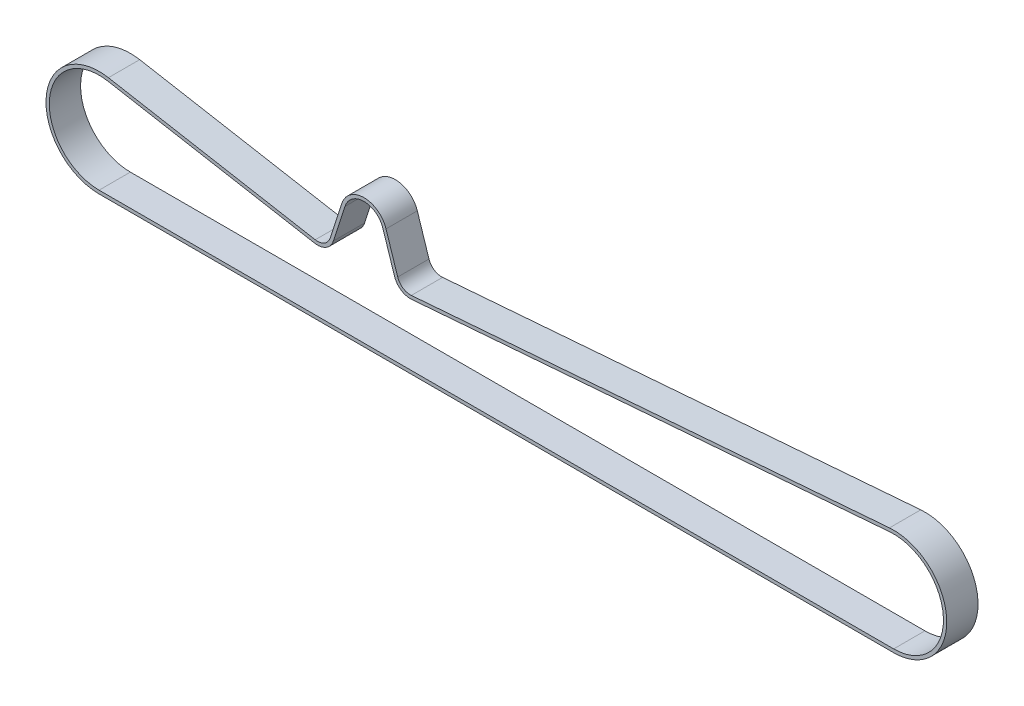
ISO-10303-21;
HEADER;
FILE_DESCRIPTION(('STEP AP214'),'2;1');
FILE_NAME('part.step','',(''),(''),'','','');
FILE_SCHEMA(('AUTOMOTIVE_DESIGN { 1 0 10303 214 1 1 1 1 }'));
ENDSEC;
DATA;
#1=APPLICATION_CONTEXT('core data for automotive mechanical design processes');
#2=APPLICATION_PROTOCOL_DEFINITION('international standard','automotive_design',2000,#1);
#3=PRODUCT_CONTEXT('',#1,'mechanical');
#4=PRODUCT('Part','Part','',(#3));
#5=PRODUCT_RELATED_PRODUCT_CATEGORY('part','',(#4));
#6=PRODUCT_DEFINITION_FORMATION('','',#4);
#7=PRODUCT_DEFINITION_CONTEXT('part definition',#1,'design');
#8=PRODUCT_DEFINITION('design','',#6,#7);
#9=PRODUCT_DEFINITION_SHAPE('','',#8);
#10=(LENGTH_UNIT() NAMED_UNIT(*) SI_UNIT(.MILLI.,.METRE.));
#11=(NAMED_UNIT(*) PLANE_ANGLE_UNIT() SI_UNIT($,.RADIAN.));
#12=(NAMED_UNIT(*) SI_UNIT($,.STERADIAN.) SOLID_ANGLE_UNIT());
#13=UNCERTAINTY_MEASURE_WITH_UNIT(LENGTH_MEASURE(1.E-05),#10,'distance_accuracy_value','');
#14=(GEOMETRIC_REPRESENTATION_CONTEXT(3) GLOBAL_UNCERTAINTY_ASSIGNED_CONTEXT((#13)) GLOBAL_UNIT_ASSIGNED_CONTEXT((#10,
#11,#12)) REPRESENTATION_CONTEXT('',''));
#15=CARTESIAN_POINT('',(0.,0.,0.));
#16=DIRECTION('',(0.,0.,1.));
#17=DIRECTION('',(1.,0.,0.));
#18=AXIS2_PLACEMENT_3D('',#15,#16,#17);
#19=CARTESIAN_POINT('',(104.775,13.6073270649897,7.5));
#20=DIRECTION('',(0.,0.,1.));
#21=DIRECTION('',(1.,0.,0.));
#22=AXIS2_PLACEMENT_3D('',#19,#20,#21);
#23=PLANE('',#22);
#24=CARTESIAN_POINT('',(104.775,13.6073270649897,7.5));
#25=DIRECTION('',(0.,0.,-1.));
#26=DIRECTION('',(1.,0.,0.));
#27=AXIS2_PLACEMENT_3D('',#24,#25,#26);
#28=CIRCLE('',#27,6.35);
#29=CARTESIAN_POINT('',(110.813645019597,11.6433346191558,7.5));
#30=VERTEX_POINT('',#29);
#31=CARTESIAN_POINT('',(103.658753775867,7.35620761587434,7.5));
#32=VERTEX_POINT('',#31);
#33=EDGE_CURVE('E294',#30,#32,#28,.T.);
#34=ORIENTED_EDGE('',*,*,#33,.T.);
#35=DIRECTION('',(-0.984428259703203,0.17578680695013,0.));
#36=VECTOR('',#35,1.);
#37=CARTESIAN_POINT('',(103.658753775867,7.35620761587434,7.5));
#38=LINE('',#37,#36);
#39=CARTESIAN_POINT('',(4.47614735877465,25.0669889909525,7.5));
#40=VERTEX_POINT('',#39);
#41=EDGE_CURVE('E297',#32,#40,#38,.T.);
#42=ORIENTED_EDGE('',*,*,#41,.T.);
#43=CARTESIAN_POINT('',(0.,0.,7.5));
#44=DIRECTION('',(0.,0.,1.));
#45=DIRECTION('',(1.,0.,0.));
#46=AXIS2_PLACEMENT_3D('',#43,#44,#45);
#47=CIRCLE('',#46,25.4635);
#48=CARTESIAN_POINT('',(0.,-25.4635,7.5));
#49=VERTEX_POINT('',#48);
#50=EDGE_CURVE('E301',#40,#49,#47,.T.);
#51=ORIENTED_EDGE('',*,*,#50,.T.);
#52=DIRECTION('',(1.,0.,0.));
#53=VECTOR('',#52,1.);
#54=CARTESIAN_POINT('',(0.,-25.4635,7.5));
#55=LINE('',#54,#53);
#56=CARTESIAN_POINT('',(381.,-25.4635,7.5));
#57=VERTEX_POINT('',#56);
#58=EDGE_CURVE('E304',#49,#57,#55,.T.);
#59=ORIENTED_EDGE('',*,*,#58,.T.);
#60=CARTESIAN_POINT('',(381.,0.,7.5));
#61=DIRECTION('',(0.,0.,1.));
#62=DIRECTION('',(-1.,0.,0.));
#63=AXIS2_PLACEMENT_3D('',#60,#61,#62);
#64=CIRCLE('',#63,25.4635);
#65=CARTESIAN_POINT('',(378.995174246493,25.3844540210751,7.5));
#66=VERTEX_POINT('',#65);
#67=EDGE_CURVE('E306',#57,#66,#64,.T.);
#68=ORIENTED_EDGE('',*,*,#67,.T.);
#69=DIRECTION('',(-0.996895714299884,-0.0787333144896342,0.));
#70=VECTOR('',#69,1.);
#71=CARTESIAN_POINT('',(378.995174246493,25.3844540210751,7.5));
#72=LINE('',#71,#70);
#73=CARTESIAN_POINT('',(149.724956547009,7.27703927918541,7.5));
#74=VERTEX_POINT('',#73);
#75=EDGE_CURVE('E308',#66,#74,#72,.T.);
#76=ORIENTED_EDGE('',*,*,#75,.T.);
#77=CARTESIAN_POINT('',(149.225,13.6073270649897,7.5));
#78=DIRECTION('',(0.,0.,-1.));
#79=DIRECTION('',(1.,0.,0.));
#80=AXIS2_PLACEMENT_3D('',#77,#78,#79);
#81=CIRCLE('',#80,6.35);
#82=CARTESIAN_POINT('',(143.186354980403,11.6433346191558,7.5));
#83=VERTEX_POINT('',#82);
#84=EDGE_CURVE('E311',#74,#83,#81,.T.);
#85=ORIENTED_EDGE('',*,*,#84,.T.);
#86=DIRECTION('',(-0.309290148950221,0.950967719621623,0.));
#87=VECTOR('',#86,1.);
#88=CARTESIAN_POINT('',(143.186354980403,11.6433346191558,7.5));
#89=LINE('',#88,#87);
#90=CARTESIAN_POINT('',(137.591783364374,28.8448427499927,7.5));
#91=VERTEX_POINT('',#90);
#92=EDGE_CURVE('E313',#83,#91,#89,.T.);
#93=ORIENTED_EDGE('',*,*,#92,.T.);
#94=CARTESIAN_POINT('',(127.,25.4,7.5));
#95=DIRECTION('',(0.,0.,1.));
#96=DIRECTION('',(-1.,0.,0.));
#97=AXIS2_PLACEMENT_3D('',#94,#95,#96);
#98=CIRCLE('',#97,11.1379);
#99=CARTESIAN_POINT('',(116.408216635626,28.8448427499927,7.5));
#100=VERTEX_POINT('',#99);
#101=EDGE_CURVE('E316',#91,#100,#98,.T.);
#102=ORIENTED_EDGE('',*,*,#101,.T.);
#103=DIRECTION('',(-0.309290148950219,-0.950967719621624,0.));
#104=VECTOR('',#103,1.);
#105=CARTESIAN_POINT('',(116.408216635626,28.8448427499927,7.5));
#106=LINE('',#105,#104);
#107=EDGE_CURVE('E319',#100,#30,#106,.T.);
#108=ORIENTED_EDGE('',*,*,#107,.T.);
#109=EDGE_LOOP('',(#34,#42,#51,#59,#68,#76,#85,#93,#102,#108));
#110=FACE_BOUND('',#109,.T.);
#111=DIRECTION('',(1.,0.,0.));
#112=VECTOR('',#111,1.);
#113=CARTESIAN_POINT('',(0.,-23.876,7.5));
#114=LINE('',#113,#112);
#115=CARTESIAN_POINT('',(0.,-23.876,7.5));
#116=VERTEX_POINT('',#115);
#117=CARTESIAN_POINT('',(381.,-23.876,7.5));
#118=VERTEX_POINT('',#117);
#119=EDGE_CURVE('E203',#116,#118,#114,.T.);
#120=ORIENTED_EDGE('',*,*,#119,.F.);
#121=CARTESIAN_POINT('',(0.,0.,7.5));
#122=DIRECTION('',(0.,0.,1.));
#123=DIRECTION('',(1.,0.,0.));
#124=AXIS2_PLACEMENT_3D('',#121,#122,#123);
#125=CIRCLE('',#124,23.876);
#126=CARTESIAN_POINT('',(4.19708580274131,23.5042091286737,7.5));
#127=VERTEX_POINT('',#126);
#128=EDGE_CURVE('E195',#127,#116,#125,.T.);
#129=ORIENTED_EDGE('',*,*,#128,.F.);
#130=DIRECTION('',(-0.984428259703203,0.17578680695013,0.));
#131=VECTOR('',#130,1.);
#132=CARTESIAN_POINT('',(103.379692219833,5.7934277535955,7.5));
#133=LINE('',#132,#131);
#134=CARTESIAN_POINT('',(103.379692219833,5.7934277535955,7.5));
#135=VERTEX_POINT('',#134);
#136=EDGE_CURVE('E239',#135,#127,#133,.T.);
#137=ORIENTED_EDGE('',*,*,#136,.F.);
#138=CARTESIAN_POINT('',(104.775,13.6073270649897,7.5));
#139=DIRECTION('',(0.,0.,-1.));
#140=DIRECTION('',(1.,0.,0.));
#141=AXIS2_PLACEMENT_3D('',#138,#139,#140);
#142=CIRCLE('',#141,7.9375);
#143=CARTESIAN_POINT('',(112.323306274497,11.1523365076973,7.5));
#144=VERTEX_POINT('',#143);
#145=EDGE_CURVE('E237',#144,#135,#142,.T.);
#146=ORIENTED_EDGE('',*,*,#145,.F.);
#147=DIRECTION('',(-0.309290148950221,-0.950967719621623,0.));
#148=VECTOR('',#147,1.);
#149=CARTESIAN_POINT('',(117.917877890526,28.3538446385342,7.5));
#150=LINE('',#149,#148);
#151=CARTESIAN_POINT('',(117.917877890526,28.3538446385342,7.5));
#152=VERTEX_POINT('',#151);
#153=EDGE_CURVE('E235',#152,#144,#150,.T.);
#154=ORIENTED_EDGE('',*,*,#153,.F.);
#155=CARTESIAN_POINT('',(127.,25.4,7.5));
#156=DIRECTION('',(0.,0.,1.));
#157=DIRECTION('',(-1.,0.,0.));
#158=AXIS2_PLACEMENT_3D('',#155,#156,#157);
#159=CIRCLE('',#158,9.5504);
#160=CARTESIAN_POINT('',(136.082122109474,28.3538446385342,7.5));
#161=VERTEX_POINT('',#160);
#162=EDGE_CURVE('E232',#161,#152,#159,.T.);
#163=ORIENTED_EDGE('',*,*,#162,.F.);
#164=DIRECTION('',(-0.309290148950221,0.950967719621623,0.));
#165=VECTOR('',#164,1.);
#166=CARTESIAN_POINT('',(141.676693725503,11.1523365076973,7.5));
#167=LINE('',#166,#165);
#168=CARTESIAN_POINT('',(141.676693725503,11.1523365076973,7.5));
#169=VERTEX_POINT('',#168);
#170=EDGE_CURVE('E229',#169,#161,#167,.T.);
#171=ORIENTED_EDGE('',*,*,#170,.F.);
#172=CARTESIAN_POINT('',(149.225,13.6073270649897,7.5));
#173=DIRECTION('',(0.,0.,-1.));
#174=DIRECTION('',(1.,0.,0.));
#175=AXIS2_PLACEMENT_3D('',#172,#173,#174);
#176=CIRCLE('',#175,7.93749999999999);
#177=CARTESIAN_POINT('',(149.849945683761,5.69446733273435,7.5));
#178=VERTEX_POINT('',#177);
#179=EDGE_CURVE('E227',#178,#169,#176,.T.);
#180=ORIENTED_EDGE('',*,*,#179,.F.);
#181=DIRECTION('',(-0.996895714299884,-0.0787333144896342,0.));
#182=VECTOR('',#181,1.);
#183=CARTESIAN_POINT('',(379.120163383245,23.801882074624,7.5));
#184=LINE('',#183,#182);
#185=CARTESIAN_POINT('',(379.120163383245,23.801882074624,7.5));
#186=VERTEX_POINT('',#185);
#187=EDGE_CURVE('E222',#186,#178,#184,.T.);
#188=ORIENTED_EDGE('',*,*,#187,.F.);
#189=CARTESIAN_POINT('',(381.,0.,7.5));
#190=DIRECTION('',(0.,0.,1.));
#191=DIRECTION('',(-1.,0.,0.));
#192=AXIS2_PLACEMENT_3D('',#189,#190,#191);
#193=CIRCLE('',#192,23.876);
#194=EDGE_CURVE('E217',#118,#186,#193,.T.);
#195=ORIENTED_EDGE('',*,*,#194,.F.);
#196=EDGE_LOOP('',(#120,#129,#137,#146,#154,#163,#171,#180,#188,#195));
#197=FACE_BOUND('',#196,.T.);
#198=ADVANCED_FACE('F45',(#110,#197),#23,.T.);
#199=CARTESIAN_POINT('',(104.775,13.6073270649897,-7.5));
#200=DIRECTION('',(0.,0.,1.));
#201=DIRECTION('',(1.,0.,0.));
#202=AXIS2_PLACEMENT_3D('',#199,#200,#201);
#203=PLANE('',#202);
#204=CARTESIAN_POINT('',(104.775,13.6073270649897,-7.5));
#205=DIRECTION('',(0.,0.,-1.));
#206=DIRECTION('',(1.,0.,0.));
#207=AXIS2_PLACEMENT_3D('',#204,#205,#206);
#208=CIRCLE('',#207,6.35);
#209=CARTESIAN_POINT('',(110.813645019597,11.6433346191558,-7.5));
#210=VERTEX_POINT('',#209);
#211=CARTESIAN_POINT('',(103.658753775867,7.35620761587434,-7.5));
#212=VERTEX_POINT('',#211);
#213=EDGE_CURVE('E212',#210,#212,#208,.T.);
#214=ORIENTED_EDGE('',*,*,#213,.F.);
#215=DIRECTION('',(-0.309290148950219,-0.950967719621624,0.));
#216=VECTOR('',#215,1.);
#217=CARTESIAN_POINT('',(116.408216635626,28.8448427499927,-7.5));
#218=LINE('',#217,#216);
#219=CARTESIAN_POINT('',(116.408216635626,28.8448427499927,-7.5));
#220=VERTEX_POINT('',#219);
#221=EDGE_CURVE('E298',#220,#210,#218,.T.);
#222=ORIENTED_EDGE('',*,*,#221,.F.);
#223=CARTESIAN_POINT('',(127.,25.4,-7.5));
#224=DIRECTION('',(0.,0.,1.));
#225=DIRECTION('',(-1.,0.,0.));
#226=AXIS2_PLACEMENT_3D('',#223,#224,#225);
#227=CIRCLE('',#226,11.1379);
#228=CARTESIAN_POINT('',(137.591783364374,28.8448427499927,-7.5));
#229=VERTEX_POINT('',#228);
#230=EDGE_CURVE('E343',#229,#220,#227,.T.);
#231=ORIENTED_EDGE('',*,*,#230,.F.);
#232=DIRECTION('',(-0.309290148950221,0.950967719621623,0.));
#233=VECTOR('',#232,1.);
#234=CARTESIAN_POINT('',(143.186354980403,11.6433346191558,-7.5));
#235=LINE('',#234,#233);
#236=CARTESIAN_POINT('',(143.186354980403,11.6433346191558,-7.5));
#237=VERTEX_POINT('',#236);
#238=EDGE_CURVE('E341',#237,#229,#235,.T.);
#239=ORIENTED_EDGE('',*,*,#238,.F.);
#240=CARTESIAN_POINT('',(149.225,13.6073270649897,-7.5));
#241=DIRECTION('',(0.,0.,-1.));
#242=DIRECTION('',(1.,0.,0.));
#243=AXIS2_PLACEMENT_3D('',#240,#241,#242);
#244=CIRCLE('',#243,6.35);
#245=CARTESIAN_POINT('',(149.724956547009,7.27703927918541,-7.5));
#246=VERTEX_POINT('',#245);
#247=EDGE_CURVE('E338',#246,#237,#244,.T.);
#248=ORIENTED_EDGE('',*,*,#247,.F.);
#249=DIRECTION('',(-0.996895714299884,-0.0787333144896342,0.));
#250=VECTOR('',#249,1.);
#251=CARTESIAN_POINT('',(378.995174246493,25.3844540210751,-7.5));
#252=LINE('',#251,#250);
#253=CARTESIAN_POINT('',(378.995174246493,25.3844540210751,-7.5));
#254=VERTEX_POINT('',#253);
#255=EDGE_CURVE('E335',#254,#246,#252,.T.);
#256=ORIENTED_EDGE('',*,*,#255,.F.);
#257=CARTESIAN_POINT('',(381.,0.,-7.5));
#258=DIRECTION('',(0.,0.,1.));
#259=DIRECTION('',(-1.,0.,0.));
#260=AXIS2_PLACEMENT_3D('',#257,#258,#259);
#261=CIRCLE('',#260,25.4635);
#262=CARTESIAN_POINT('',(381.,-25.4635,-7.5));
#263=VERTEX_POINT('',#262);
#264=EDGE_CURVE('E333',#263,#254,#261,.T.);
#265=ORIENTED_EDGE('',*,*,#264,.F.);
#266=DIRECTION('',(1.,0.,0.));
#267=VECTOR('',#266,1.);
#268=CARTESIAN_POINT('',(0.,-25.4635,-7.5));
#269=LINE('',#268,#267);
#270=CARTESIAN_POINT('',(0.,-25.4635,-7.5));
#271=VERTEX_POINT('',#270);
#272=EDGE_CURVE('E330',#271,#263,#269,.T.);
#273=ORIENTED_EDGE('',*,*,#272,.F.);
#274=CARTESIAN_POINT('',(0.,0.,-7.5));
#275=DIRECTION('',(0.,0.,1.));
#276=DIRECTION('',(1.,0.,0.));
#277=AXIS2_PLACEMENT_3D('',#274,#275,#276);
#278=CIRCLE('',#277,25.4635);
#279=CARTESIAN_POINT('',(4.47614735877465,25.0669889909525,-7.5));
#280=VERTEX_POINT('',#279);
#281=EDGE_CURVE('E327',#280,#271,#278,.T.);
#282=ORIENTED_EDGE('',*,*,#281,.F.);
#283=DIRECTION('',(-0.984428259703203,0.17578680695013,0.));
#284=VECTOR('',#283,1.);
#285=CARTESIAN_POINT('',(103.658753775867,7.35620761587434,-7.5));
#286=LINE('',#285,#284);
#287=EDGE_CURVE('E324',#212,#280,#286,.T.);
#288=ORIENTED_EDGE('',*,*,#287,.F.);
#289=EDGE_LOOP('',(#214,#222,#231,#239,#248,#256,#265,#273,#282,#288));
#290=FACE_BOUND('',#289,.T.);
#291=CARTESIAN_POINT('',(0.,0.,-7.5));
#292=DIRECTION('',(0.,0.,1.));
#293=DIRECTION('',(1.,0.,0.));
#294=AXIS2_PLACEMENT_3D('',#291,#292,#293);
#295=CIRCLE('',#294,23.876);
#296=CARTESIAN_POINT('',(4.19708580274132,23.5042091286737,-7.5));
#297=VERTEX_POINT('',#296);
#298=CARTESIAN_POINT('',(0.,-23.876,-7.5));
#299=VERTEX_POINT('',#298);
#300=EDGE_CURVE('E68',#297,#299,#295,.T.);
#301=ORIENTED_EDGE('',*,*,#300,.T.);
#302=DIRECTION('',(1.,0.,0.));
#303=VECTOR('',#302,1.);
#304=CARTESIAN_POINT('',(0.,-23.876,-7.5));
#305=LINE('',#304,#303);
#306=CARTESIAN_POINT('',(381.,-23.876,-7.5));
#307=VERTEX_POINT('',#306);
#308=EDGE_CURVE('E210',#299,#307,#305,.T.);
#309=ORIENTED_EDGE('',*,*,#308,.T.);
#310=CARTESIAN_POINT('',(381.,0.,-7.5));
#311=DIRECTION('',(0.,0.,1.));
#312=DIRECTION('',(-1.,0.,0.));
#313=AXIS2_PLACEMENT_3D('',#310,#311,#312);
#314=CIRCLE('',#313,23.876);
#315=CARTESIAN_POINT('',(379.120163383245,23.801882074624,-7.5));
#316=VERTEX_POINT('',#315);
#317=EDGE_CURVE('E246',#307,#316,#314,.T.);
#318=ORIENTED_EDGE('',*,*,#317,.T.);
#319=DIRECTION('',(-0.996895714299884,-0.0787333144896342,0.));
#320=VECTOR('',#319,1.);
#321=CARTESIAN_POINT('',(379.120163383245,23.801882074624,-7.5));
#322=LINE('',#321,#320);
#323=CARTESIAN_POINT('',(149.849945683761,5.69446733273435,-7.5));
#324=VERTEX_POINT('',#323);
#325=EDGE_CURVE('E249',#316,#324,#322,.T.);
#326=ORIENTED_EDGE('',*,*,#325,.T.);
#327=CARTESIAN_POINT('',(149.225,13.6073270649897,-7.5));
#328=DIRECTION('',(0.,0.,-1.));
#329=DIRECTION('',(1.,0.,0.));
#330=AXIS2_PLACEMENT_3D('',#327,#328,#329);
#331=CIRCLE('',#330,7.93749999999999);
#332=CARTESIAN_POINT('',(141.676693725503,11.1523365076973,-7.5));
#333=VERTEX_POINT('',#332);
#334=EDGE_CURVE('E253',#324,#333,#331,.T.);
#335=ORIENTED_EDGE('',*,*,#334,.T.);
#336=DIRECTION('',(-0.309290148950221,0.950967719621623,0.));
#337=VECTOR('',#336,1.);
#338=CARTESIAN_POINT('',(141.676693725503,11.1523365076973,-7.5));
#339=LINE('',#338,#337);
#340=CARTESIAN_POINT('',(136.082122109474,28.3538446385342,-7.5));
#341=VERTEX_POINT('',#340);
#342=EDGE_CURVE('E257',#333,#341,#339,.T.);
#343=ORIENTED_EDGE('',*,*,#342,.T.);
#344=CARTESIAN_POINT('',(127.,25.4,-7.5));
#345=DIRECTION('',(0.,0.,1.));
#346=DIRECTION('',(-1.,0.,0.));
#347=AXIS2_PLACEMENT_3D('',#344,#345,#346);
#348=CIRCLE('',#347,9.5504);
#349=CARTESIAN_POINT('',(117.917877890526,28.3538446385342,-7.5));
#350=VERTEX_POINT('',#349);
#351=EDGE_CURVE('E261',#341,#350,#348,.T.);
#352=ORIENTED_EDGE('',*,*,#351,.T.);
#353=DIRECTION('',(-0.309290148950221,-0.950967719621623,0.));
#354=VECTOR('',#353,1.);
#355=CARTESIAN_POINT('',(117.917877890526,28.3538446385342,-7.5));
#356=LINE('',#355,#354);
#357=CARTESIAN_POINT('',(112.323306274497,11.1523365076973,-7.5));
#358=VERTEX_POINT('',#357);
#359=EDGE_CURVE('E265',#350,#358,#356,.T.);
#360=ORIENTED_EDGE('',*,*,#359,.T.);
#361=CARTESIAN_POINT('',(104.775,13.6073270649897,-7.5));
#362=DIRECTION('',(0.,0.,-1.));
#363=DIRECTION('',(1.,0.,0.));
#364=AXIS2_PLACEMENT_3D('',#361,#362,#363);
#365=CIRCLE('',#364,7.9375);
#366=CARTESIAN_POINT('',(103.379692219833,5.79342775359551,-7.5));
#367=VERTEX_POINT('',#366);
#368=EDGE_CURVE('E269',#358,#367,#365,.T.);
#369=ORIENTED_EDGE('',*,*,#368,.T.);
#370=DIRECTION('',(-0.984428259703203,0.17578680695013,0.));
#371=VECTOR('',#370,1.);
#372=CARTESIAN_POINT('',(103.379692219833,5.7934277535955,-7.5));
#373=LINE('',#372,#371);
#374=EDGE_CURVE('E204',#367,#297,#373,.T.);
#375=ORIENTED_EDGE('',*,*,#374,.T.);
#376=EDGE_LOOP('',(#301,#309,#318,#326,#335,#343,#352,#360,#369,#375));
#377=FACE_BOUND('',#376,.T.);
#378=ADVANCED_FACE('F386',(#290,#377),#203,.F.);
#379=CARTESIAN_POINT('',(104.775,13.6073270649897,7.5));
#380=DIRECTION('',(0.,0.,-1.));
#381=DIRECTION('',(-1.,0.,0.));
#382=AXIS2_PLACEMENT_3D('',#379,#380,#381);
#383=CYLINDRICAL_SURFACE('',#382,6.35);
#384=ORIENTED_EDGE('',*,*,#213,.T.);
#385=DIRECTION('',(0.,0.,-1.));
#386=VECTOR('',#385,1.);
#387=CARTESIAN_POINT('',(103.658753775867,7.35620761587434,7.5));
#388=LINE('',#387,#386);
#389=EDGE_CURVE('E11',#32,#212,#388,.T.);
#390=ORIENTED_EDGE('',*,*,#389,.F.);
#391=ORIENTED_EDGE('',*,*,#33,.F.);
#392=DIRECTION('',(0.,0.,-1.));
#393=VECTOR('',#392,1.);
#394=CARTESIAN_POINT('',(110.813645019597,11.6433346191558,7.5));
#395=LINE('',#394,#393);
#396=EDGE_CURVE('E321',#30,#210,#395,.T.);
#397=ORIENTED_EDGE('',*,*,#396,.T.);
#398=EDGE_LOOP('',(#384,#390,#391,#397));
#399=FACE_BOUND('',#398,.T.);
#400=ADVANCED_FACE('F47',(#399),#383,.F.);
#401=CARTESIAN_POINT('',(103.658753775867,7.35620761587434,7.5));
#402=DIRECTION('',(-0.17578680695013,-0.984428259703203,0.));
#403=DIRECTION('',(0.984428259703203,-0.17578680695013,0.));
#404=AXIS2_PLACEMENT_3D('',#401,#402,#403);
#405=PLANE('',#404);
#406=ORIENTED_EDGE('',*,*,#287,.T.);
#407=DIRECTION('',(0.,0.,-1.));
#408=VECTOR('',#407,1.);
#409=CARTESIAN_POINT('',(4.47614735877465,25.0669889909525,7.5));
#410=LINE('',#409,#408);
#411=EDGE_CURVE('E53',#40,#280,#410,.T.);
#412=ORIENTED_EDGE('',*,*,#411,.F.);
#413=ORIENTED_EDGE('',*,*,#41,.F.);
#414=ORIENTED_EDGE('',*,*,#389,.T.);
#415=EDGE_LOOP('',(#406,#412,#413,#414));
#416=FACE_BOUND('',#415,.T.);
#417=ADVANCED_FACE('F403',(#416),#405,.F.);
#418=CARTESIAN_POINT('',(0.,0.,7.5));
#419=DIRECTION('',(0.,0.,-1.));
#420=DIRECTION('',(-1.,0.,0.));
#421=AXIS2_PLACEMENT_3D('',#418,#419,#420);
#422=CYLINDRICAL_SURFACE('',#421,25.4635);
#423=ORIENTED_EDGE('',*,*,#281,.T.);
#424=DIRECTION('',(0.,0.,-1.));
#425=VECTOR('',#424,1.);
#426=CARTESIAN_POINT('',(0.,-25.4635,7.5));
#427=LINE('',#426,#425);
#428=EDGE_CURVE('E372',#49,#271,#427,.T.);
#429=ORIENTED_EDGE('',*,*,#428,.F.);
#430=ORIENTED_EDGE('',*,*,#50,.F.);
#431=ORIENTED_EDGE('',*,*,#411,.T.);
#432=EDGE_LOOP('',(#423,#429,#430,#431));
#433=FACE_BOUND('',#432,.T.);
#434=ADVANCED_FACE('F380',(#433),#422,.T.);
#435=CARTESIAN_POINT('',(0.,-25.4635,7.5));
#436=DIRECTION('',(0.,1.,0.));
#437=DIRECTION('',(-1.,0.,0.));
#438=AXIS2_PLACEMENT_3D('',#435,#436,#437);
#439=PLANE('',#438);
#440=ORIENTED_EDGE('',*,*,#272,.T.);
#441=DIRECTION('',(0.,0.,-1.));
#442=VECTOR('',#441,1.);
#443=CARTESIAN_POINT('',(381.,-25.4635,7.5));
#444=LINE('',#443,#442);
#445=EDGE_CURVE('E369',#57,#263,#444,.T.);
#446=ORIENTED_EDGE('',*,*,#445,.F.);
#447=ORIENTED_EDGE('',*,*,#58,.F.);
#448=ORIENTED_EDGE('',*,*,#428,.T.);
#449=EDGE_LOOP('',(#440,#446,#447,#448));
#450=FACE_BOUND('',#449,.T.);
#451=ADVANCED_FACE('F392',(#450),#439,.F.);
#452=CARTESIAN_POINT('',(381.,0.,7.5));
#453=DIRECTION('',(0.,0.,-1.));
#454=DIRECTION('',(-1.,0.,0.));
#455=AXIS2_PLACEMENT_3D('',#452,#453,#454);
#456=CYLINDRICAL_SURFACE('',#455,25.4635);
#457=ORIENTED_EDGE('',*,*,#264,.T.);
#458=DIRECTION('',(0.,0.,-1.));
#459=VECTOR('',#458,1.);
#460=CARTESIAN_POINT('',(378.995174246493,25.3844540210751,7.5));
#461=LINE('',#460,#459);
#462=EDGE_CURVE('E366',#66,#254,#461,.T.);
#463=ORIENTED_EDGE('',*,*,#462,.F.);
#464=ORIENTED_EDGE('',*,*,#67,.F.);
#465=ORIENTED_EDGE('',*,*,#445,.T.);
#466=EDGE_LOOP('',(#457,#463,#464,#465));
#467=FACE_BOUND('',#466,.T.);
#468=ADVANCED_FACE('F396',(#467),#456,.T.);
#469=CARTESIAN_POINT('',(378.995174246493,25.3844540210751,7.5));
#470=DIRECTION('',(0.0787333144896342,-0.996895714299884,0.));
#471=DIRECTION('',(0.996895714299884,0.0787333144896342,0.));
#472=AXIS2_PLACEMENT_3D('',#469,#470,#471);
#473=PLANE('',#472);
#474=ORIENTED_EDGE('',*,*,#255,.T.);
#475=DIRECTION('',(0.,0.,-1.));
#476=VECTOR('',#475,1.);
#477=CARTESIAN_POINT('',(149.724956547009,7.27703927918541,7.5));
#478=LINE('',#477,#476);
#479=EDGE_CURVE('E362',#74,#246,#478,.T.);
#480=ORIENTED_EDGE('',*,*,#479,.F.);
#481=ORIENTED_EDGE('',*,*,#75,.F.);
#482=ORIENTED_EDGE('',*,*,#462,.T.);
#483=EDGE_LOOP('',(#474,#480,#481,#482));
#484=FACE_BOUND('',#483,.T.);
#485=ADVANCED_FACE('F426',(#484),#473,.F.);
#486=CARTESIAN_POINT('',(149.225,13.6073270649897,7.5));
#487=DIRECTION('',(0.,0.,-1.));
#488=DIRECTION('',(-1.,0.,0.));
#489=AXIS2_PLACEMENT_3D('',#486,#487,#488);
#490=CYLINDRICAL_SURFACE('',#489,6.35);
#491=ORIENTED_EDGE('',*,*,#247,.T.);
#492=DIRECTION('',(0.,0.,-1.));
#493=VECTOR('',#492,1.);
#494=CARTESIAN_POINT('',(143.186354980403,11.6433346191558,7.5));
#495=LINE('',#494,#493);
#496=EDGE_CURVE('E358',#83,#237,#495,.T.);
#497=ORIENTED_EDGE('',*,*,#496,.F.);
#498=ORIENTED_EDGE('',*,*,#84,.F.);
#499=ORIENTED_EDGE('',*,*,#479,.T.);
#500=EDGE_LOOP('',(#491,#497,#498,#499));
#501=FACE_BOUND('',#500,.T.);
#502=ADVANCED_FACE('F423',(#501),#490,.F.);
#503=CARTESIAN_POINT('',(143.186354980403,11.6433346191558,7.5));
#504=DIRECTION('',(-0.950967719621623,-0.309290148950221,0.));
#505=DIRECTION('',(0.309290148950221,-0.950967719621623,0.));
#506=AXIS2_PLACEMENT_3D('',#503,#504,#505);
#507=PLANE('',#506);
#508=ORIENTED_EDGE('',*,*,#238,.T.);
#509=DIRECTION('',(0.,0.,-1.));
#510=VECTOR('',#509,1.);
#511=CARTESIAN_POINT('',(137.591783364374,28.8448427499927,7.5));
#512=LINE('',#511,#510);
#513=EDGE_CURVE('E354',#91,#229,#512,.T.);
#514=ORIENTED_EDGE('',*,*,#513,.F.);
#515=ORIENTED_EDGE('',*,*,#92,.F.);
#516=ORIENTED_EDGE('',*,*,#496,.T.);
#517=EDGE_LOOP('',(#508,#514,#515,#516));
#518=FACE_BOUND('',#517,.T.);
#519=ADVANCED_FACE('F419',(#518),#507,.F.);
#520=CARTESIAN_POINT('',(127.,25.4,7.5));
#521=DIRECTION('',(0.,0.,-1.));
#522=DIRECTION('',(-1.,0.,0.));
#523=AXIS2_PLACEMENT_3D('',#520,#521,#522);
#524=CYLINDRICAL_SURFACE('',#523,11.1379);
#525=ORIENTED_EDGE('',*,*,#230,.T.);
#526=DIRECTION('',(0.,0.,-1.));
#527=VECTOR('',#526,1.);
#528=CARTESIAN_POINT('',(116.408216635626,28.8448427499927,7.5));
#529=LINE('',#528,#527);
#530=EDGE_CURVE('E350',#100,#220,#529,.T.);
#531=ORIENTED_EDGE('',*,*,#530,.F.);
#532=ORIENTED_EDGE('',*,*,#101,.F.);
#533=ORIENTED_EDGE('',*,*,#513,.T.);
#534=EDGE_LOOP('',(#525,#531,#532,#533));
#535=FACE_BOUND('',#534,.T.);
#536=ADVANCED_FACE('F415',(#535),#524,.T.);
#537=CARTESIAN_POINT('',(116.408216635626,28.8448427499927,7.5));
#538=DIRECTION('',(0.950967719621624,-0.309290148950219,0.));
#539=DIRECTION('',(0.309290148950219,0.950967719621624,0.));
#540=AXIS2_PLACEMENT_3D('',#537,#538,#539);
#541=PLANE('',#540);
#542=ORIENTED_EDGE('',*,*,#221,.T.);
#543=ORIENTED_EDGE('',*,*,#396,.F.);
#544=ORIENTED_EDGE('',*,*,#107,.F.);
#545=ORIENTED_EDGE('',*,*,#530,.T.);
#546=EDGE_LOOP('',(#542,#543,#544,#545));
#547=FACE_BOUND('',#546,.T.);
#548=ADVANCED_FACE('F410',(#547),#541,.F.);
#549=CARTESIAN_POINT('',(0.,0.,7.5));
#550=DIRECTION('',(0.,0.,-1.));
#551=DIRECTION('',(-1.,0.,0.));
#552=AXIS2_PLACEMENT_3D('',#549,#550,#551);
#553=CYLINDRICAL_SURFACE('',#552,23.876);
#554=ORIENTED_EDGE('',*,*,#300,.F.);
#555=DIRECTION('',(0.,0.,-1.));
#556=VECTOR('',#555,1.);
#557=CARTESIAN_POINT('',(4.19708580274131,23.5042091286737,7.5));
#558=LINE('',#557,#556);
#559=EDGE_CURVE('E199',#127,#297,#558,.T.);
#560=ORIENTED_EDGE('',*,*,#559,.F.);
#561=ORIENTED_EDGE('',*,*,#128,.T.);
#562=DIRECTION('',(0.,0.,-1.));
#563=VECTOR('',#562,1.);
#564=CARTESIAN_POINT('',(0.,-23.876,7.5));
#565=LINE('',#564,#563);
#566=EDGE_CURVE('E198',#116,#299,#565,.T.);
#567=ORIENTED_EDGE('',*,*,#566,.T.);
#568=EDGE_LOOP('',(#554,#560,#561,#567));
#569=FACE_BOUND('',#568,.T.);
#570=ADVANCED_FACE('F197',(#569),#553,.F.);
#571=CARTESIAN_POINT('',(0.,-23.876,7.5));
#572=DIRECTION('',(0.,1.,0.));
#573=DIRECTION('',(-1.,0.,0.));
#574=AXIS2_PLACEMENT_3D('',#571,#572,#573);
#575=PLANE('',#574);
#576=ORIENTED_EDGE('',*,*,#308,.F.);
#577=ORIENTED_EDGE('',*,*,#566,.F.);
#578=ORIENTED_EDGE('',*,*,#119,.T.);
#579=DIRECTION('',(0.,0.,-1.));
#580=VECTOR('',#579,1.);
#581=CARTESIAN_POINT('',(381.,-23.876,7.5));
#582=LINE('',#581,#580);
#583=EDGE_CURVE('E213',#118,#307,#582,.T.);
#584=ORIENTED_EDGE('',*,*,#583,.T.);
#585=EDGE_LOOP('',(#576,#577,#578,#584));
#586=FACE_BOUND('',#585,.T.);
#587=ADVANCED_FACE('F207',(#586),#575,.T.);
#588=CARTESIAN_POINT('',(381.,0.,7.5));
#589=DIRECTION('',(0.,0.,-1.));
#590=DIRECTION('',(-1.,0.,0.));
#591=AXIS2_PLACEMENT_3D('',#588,#589,#590);
#592=CYLINDRICAL_SURFACE('',#591,23.876);
#593=ORIENTED_EDGE('',*,*,#317,.F.);
#594=ORIENTED_EDGE('',*,*,#583,.F.);
#595=ORIENTED_EDGE('',*,*,#194,.T.);
#596=DIRECTION('',(0.,0.,-1.));
#597=VECTOR('',#596,1.);
#598=CARTESIAN_POINT('',(379.120163383245,23.801882074624,7.5));
#599=LINE('',#598,#597);
#600=EDGE_CURVE('E291',#186,#316,#599,.T.);
#601=ORIENTED_EDGE('',*,*,#600,.T.);
#602=EDGE_LOOP('',(#593,#594,#595,#601));
#603=FACE_BOUND('',#602,.T.);
#604=ADVANCED_FACE('F476',(#603),#592,.F.);
#605=CARTESIAN_POINT('',(379.120163383245,23.801882074624,7.5));
#606=DIRECTION('',(0.0787333144896342,-0.996895714299884,0.));
#607=DIRECTION('',(0.996895714299884,0.0787333144896342,0.));
#608=AXIS2_PLACEMENT_3D('',#605,#606,#607);
#609=PLANE('',#608);
#610=ORIENTED_EDGE('',*,*,#325,.F.);
#611=ORIENTED_EDGE('',*,*,#600,.F.);
#612=ORIENTED_EDGE('',*,*,#187,.T.);
#613=DIRECTION('',(0.,0.,-1.));
#614=VECTOR('',#613,1.);
#615=CARTESIAN_POINT('',(149.849945683761,5.69446733273435,7.5));
#616=LINE('',#615,#614);
#617=EDGE_CURVE('E288',#178,#324,#616,.T.);
#618=ORIENTED_EDGE('',*,*,#617,.T.);
#619=EDGE_LOOP('',(#610,#611,#612,#618));
#620=FACE_BOUND('',#619,.T.);
#621=ADVANCED_FACE('F483',(#620),#609,.T.);
#622=CARTESIAN_POINT('',(149.225,13.6073270649897,7.5));
#623=DIRECTION('',(0.,0.,-1.));
#624=DIRECTION('',(-1.,0.,0.));
#625=AXIS2_PLACEMENT_3D('',#622,#623,#624);
#626=CYLINDRICAL_SURFACE('',#625,7.93749999999999);
#627=ORIENTED_EDGE('',*,*,#334,.F.);
#628=ORIENTED_EDGE('',*,*,#617,.F.);
#629=ORIENTED_EDGE('',*,*,#179,.T.);
#630=DIRECTION('',(0.,0.,-1.));
#631=VECTOR('',#630,1.);
#632=CARTESIAN_POINT('',(141.676693725503,11.1523365076973,7.5));
#633=LINE('',#632,#631);
#634=EDGE_CURVE('E285',#169,#333,#633,.T.);
#635=ORIENTED_EDGE('',*,*,#634,.T.);
#636=EDGE_LOOP('',(#627,#628,#629,#635));
#637=FACE_BOUND('',#636,.T.);
#638=ADVANCED_FACE('F492',(#637),#626,.T.);
#639=CARTESIAN_POINT('',(141.676693725503,11.1523365076973,7.5));
#640=DIRECTION('',(-0.950967719621623,-0.309290148950221,0.));
#641=DIRECTION('',(0.309290148950221,-0.950967719621623,0.));
#642=AXIS2_PLACEMENT_3D('',#639,#640,#641);
#643=PLANE('',#642);
#644=ORIENTED_EDGE('',*,*,#342,.F.);
#645=ORIENTED_EDGE('',*,*,#634,.F.);
#646=ORIENTED_EDGE('',*,*,#170,.T.);
#647=DIRECTION('',(0.,0.,-1.));
#648=VECTOR('',#647,1.);
#649=CARTESIAN_POINT('',(136.082122109474,28.3538446385342,7.5));
#650=LINE('',#649,#648);
#651=EDGE_CURVE('E282',#161,#341,#650,.T.);
#652=ORIENTED_EDGE('',*,*,#651,.T.);
#653=EDGE_LOOP('',(#644,#645,#646,#652));
#654=FACE_BOUND('',#653,.T.);
#655=ADVANCED_FACE('F501',(#654),#643,.T.);
#656=CARTESIAN_POINT('',(127.,25.4,7.5));
#657=DIRECTION('',(0.,0.,-1.));
#658=DIRECTION('',(-1.,0.,0.));
#659=AXIS2_PLACEMENT_3D('',#656,#657,#658);
#660=CYLINDRICAL_SURFACE('',#659,9.5504);
#661=ORIENTED_EDGE('',*,*,#351,.F.);
#662=ORIENTED_EDGE('',*,*,#651,.F.);
#663=ORIENTED_EDGE('',*,*,#162,.T.);
#664=DIRECTION('',(0.,0.,-1.));
#665=VECTOR('',#664,1.);
#666=CARTESIAN_POINT('',(117.917877890526,28.3538446385342,7.5));
#667=LINE('',#666,#665);
#668=EDGE_CURVE('E279',#152,#350,#667,.T.);
#669=ORIENTED_EDGE('',*,*,#668,.T.);
#670=EDGE_LOOP('',(#661,#662,#663,#669));
#671=FACE_BOUND('',#670,.T.);
#672=ADVANCED_FACE('F510',(#671),#660,.F.);
#673=CARTESIAN_POINT('',(117.917877890526,28.3538446385342,7.5));
#674=DIRECTION('',(0.950967719621623,-0.309290148950221,0.));
#675=DIRECTION('',(0.309290148950221,0.950967719621623,0.));
#676=AXIS2_PLACEMENT_3D('',#673,#674,#675);
#677=PLANE('',#676);
#678=ORIENTED_EDGE('',*,*,#359,.F.);
#679=ORIENTED_EDGE('',*,*,#668,.F.);
#680=ORIENTED_EDGE('',*,*,#153,.T.);
#681=DIRECTION('',(0.,0.,-1.));
#682=VECTOR('',#681,1.);
#683=CARTESIAN_POINT('',(112.323306274497,11.1523365076973,7.5));
#684=LINE('',#683,#682);
#685=EDGE_CURVE('E277',#144,#358,#684,.T.);
#686=ORIENTED_EDGE('',*,*,#685,.T.);
#687=EDGE_LOOP('',(#678,#679,#680,#686));
#688=FACE_BOUND('',#687,.T.);
#689=ADVANCED_FACE('F519',(#688),#677,.T.);
#690=CARTESIAN_POINT('',(104.775,13.6073270649897,7.5));
#691=DIRECTION('',(0.,0.,-1.));
#692=DIRECTION('',(-1.,0.,0.));
#693=AXIS2_PLACEMENT_3D('',#690,#691,#692);
#694=CYLINDRICAL_SURFACE('',#693,7.9375);
#695=ORIENTED_EDGE('',*,*,#368,.F.);
#696=ORIENTED_EDGE('',*,*,#685,.F.);
#697=ORIENTED_EDGE('',*,*,#145,.T.);
#698=DIRECTION('',(0.,0.,-1.));
#699=VECTOR('',#698,1.);
#700=CARTESIAN_POINT('',(103.379692219833,5.79342775359551,7.5));
#701=LINE('',#700,#699);
#702=EDGE_CURVE('E60',#135,#367,#701,.T.);
#703=ORIENTED_EDGE('',*,*,#702,.T.);
#704=EDGE_LOOP('',(#695,#696,#697,#703));
#705=FACE_BOUND('',#704,.T.);
#706=ADVANCED_FACE('F528',(#705),#694,.T.);
#707=CARTESIAN_POINT('',(103.379692219833,5.7934277535955,7.5));
#708=DIRECTION('',(-0.17578680695013,-0.984428259703203,0.));
#709=DIRECTION('',(0.984428259703203,-0.17578680695013,0.));
#710=AXIS2_PLACEMENT_3D('',#707,#708,#709);
#711=PLANE('',#710);
#712=ORIENTED_EDGE('',*,*,#374,.F.);
#713=ORIENTED_EDGE('',*,*,#702,.F.);
#714=ORIENTED_EDGE('',*,*,#136,.T.);
#715=ORIENTED_EDGE('',*,*,#559,.T.);
#716=EDGE_LOOP('',(#712,#713,#714,#715));
#717=FACE_BOUND('',#716,.T.);
#718=ADVANCED_FACE('F537',(#717),#711,.T.);
#719=CLOSED_SHELL('',(#198,#378,#400,#417,#434,#451,#468,#485,#502,#519,#536,#548,#570,#587,
#604,#621,#638,#655,#672,#689,#706,#718));
#720=MANIFOLD_SOLID_BREP('B2',#719);
#721=ADVANCED_BREP_SHAPE_REPRESENTATION('',(#18,#720),#14);
#722=SHAPE_DEFINITION_REPRESENTATION(#9,#721);
ENDSEC;
END-ISO-10303-21;
